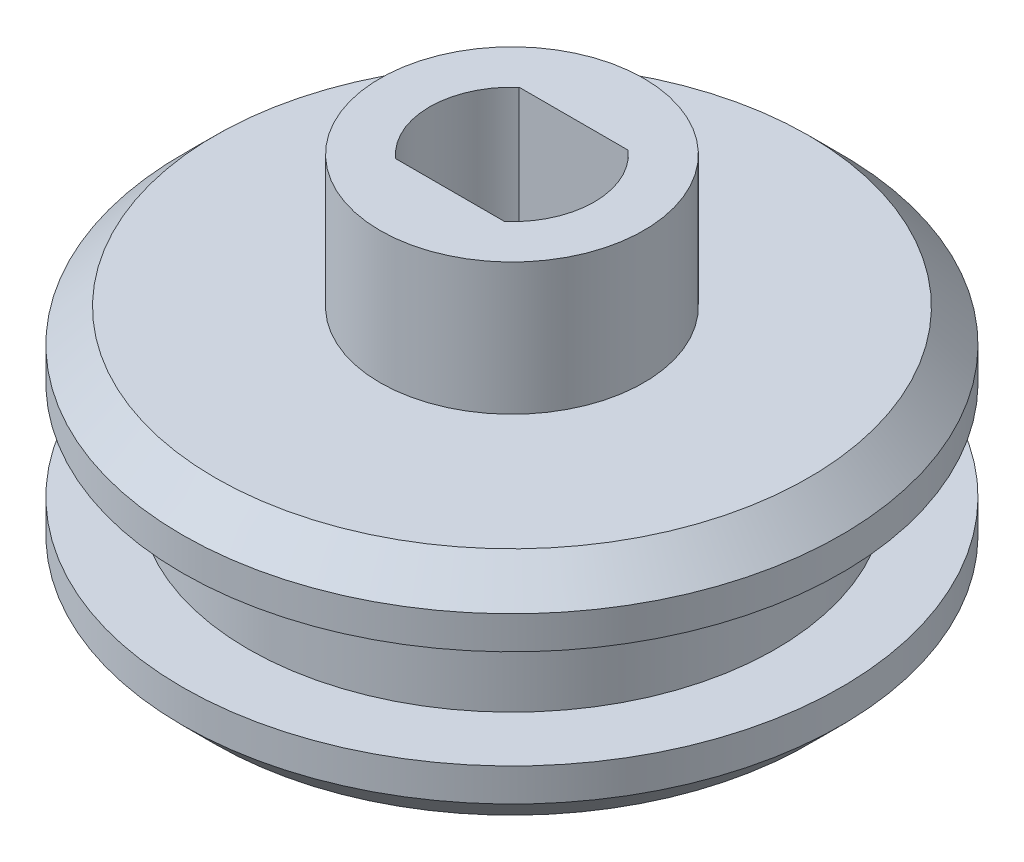
ISO-10303-21;
HEADER;
FILE_DESCRIPTION(('STEP AP214'),'2;1');
FILE_NAME('part.step','',(''),(''),'','','');
FILE_SCHEMA(('AUTOMOTIVE_DESIGN { 1 0 10303 214 1 1 1 1 }'));
ENDSEC;
DATA;
#1=APPLICATION_CONTEXT('core data for automotive mechanical design processes');
#2=APPLICATION_PROTOCOL_DEFINITION('international standard','automotive_design',2000,#1);
#3=PRODUCT_CONTEXT('',#1,'mechanical');
#4=PRODUCT('Part','Part','',(#3));
#5=PRODUCT_RELATED_PRODUCT_CATEGORY('part','',(#4));
#6=PRODUCT_DEFINITION_FORMATION('','',#4);
#7=PRODUCT_DEFINITION_CONTEXT('part definition',#1,'design');
#8=PRODUCT_DEFINITION('design','',#6,#7);
#9=PRODUCT_DEFINITION_SHAPE('','',#8);
#10=(LENGTH_UNIT() NAMED_UNIT(*) SI_UNIT(.MILLI.,.METRE.));
#11=(NAMED_UNIT(*) PLANE_ANGLE_UNIT() SI_UNIT($,.RADIAN.));
#12=(NAMED_UNIT(*) SI_UNIT($,.STERADIAN.) SOLID_ANGLE_UNIT());
#13=UNCERTAINTY_MEASURE_WITH_UNIT(LENGTH_MEASURE(1.E-05),#10,'distance_accuracy_value','');
#14=(GEOMETRIC_REPRESENTATION_CONTEXT(3) GLOBAL_UNCERTAINTY_ASSIGNED_CONTEXT((#13)) GLOBAL_UNIT_ASSIGNED_CONTEXT((#10,
#11,#12)) REPRESENTATION_CONTEXT('',''));
#15=CARTESIAN_POINT('',(0.,0.,0.));
#16=DIRECTION('',(0.,0.,1.));
#17=DIRECTION('',(1.,0.,0.));
#18=AXIS2_PLACEMENT_3D('',#15,#16,#17);
#19=CARTESIAN_POINT('',(0.,11.,0.));
#20=DIRECTION('',(0.,-1.,0.));
#21=DIRECTION('',(0.,0.,-1.));
#22=AXIS2_PLACEMENT_3D('',#19,#20,#21);
#23=CYLINDRICAL_SURFACE('',#22,1.);
#24=CARTESIAN_POINT('',(0.,7.,0.));
#25=DIRECTION('',(0.,1.,0.));
#26=DIRECTION('',(0.,0.,1.));
#27=AXIS2_PLACEMENT_3D('',#24,#25,#26);
#28=CIRCLE('',#27,1.);
#29=CARTESIAN_POINT('',(0.,7.,1.));
#30=VERTEX_POINT('',#29);
#31=EDGE_CURVE('E128',#30,#30,#28,.T.);
#32=ORIENTED_EDGE('',*,*,#31,.T.);
#33=EDGE_LOOP('',(#32));
#34=FACE_BOUND('',#33,.T.);
#35=CARTESIAN_POINT('',(0.,5.,0.));
#36=DIRECTION('',(0.,-1.,0.));
#37=DIRECTION('',(0.,0.,-1.));
#38=AXIS2_PLACEMENT_3D('',#35,#36,#37);
#39=CIRCLE('',#38,1.);
#40=CARTESIAN_POINT('',(0.,5.,-1.));
#41=VERTEX_POINT('',#40);
#42=EDGE_CURVE('E50',#41,#41,#39,.F.);
#43=ORIENTED_EDGE('',*,*,#42,.F.);
#44=EDGE_LOOP('',(#43));
#45=FACE_BOUND('',#44,.T.);
#46=ADVANCED_FACE('F45',(#34,#45),#23,.F.);
#47=CARTESIAN_POINT('',(0.,11.,0.));
#48=DIRECTION('',(0.,1.,0.));
#49=DIRECTION('',(0.,0.,1.));
#50=AXIS2_PLACEMENT_3D('',#47,#48,#49);
#51=PLANE('',#50);
#52=CARTESIAN_POINT('',(0.,11.,0.));
#53=DIRECTION('',(0.,1.,0.));
#54=DIRECTION('',(0.,0.,1.));
#55=AXIS2_PLACEMENT_3D('',#52,#53,#54);
#56=CIRCLE('',#55,4.);
#57=CARTESIAN_POINT('',(0.,11.,4.));
#58=VERTEX_POINT('',#57);
#59=EDGE_CURVE('E111',#58,#58,#56,.T.);
#60=ORIENTED_EDGE('',*,*,#59,.T.);
#61=EDGE_LOOP('',(#60));
#62=FACE_BOUND('',#61,.T.);
#63=DIRECTION('',(-1.,0.,0.));
#64=VECTOR('',#63,1.);
#65=CARTESIAN_POINT('',(-1.65359456941537,11.,-1.875));
#66=LINE('',#65,#64);
#67=CARTESIAN_POINT('',(1.65359456941537,11.,-1.875));
#68=VERTEX_POINT('',#67);
#69=CARTESIAN_POINT('',(-1.65359456941537,11.,-1.875));
#70=VERTEX_POINT('',#69);
#71=EDGE_CURVE('E103',#68,#70,#66,.T.);
#72=ORIENTED_EDGE('',*,*,#71,.F.);
#73=CARTESIAN_POINT('',(0.,11.,0.));
#74=DIRECTION('',(0.,1.,0.));
#75=DIRECTION('',(0.,0.,1.));
#76=AXIS2_PLACEMENT_3D('',#73,#74,#75);
#77=CIRCLE('',#76,2.5);
#78=CARTESIAN_POINT('',(1.65359456941537,11.,1.875));
#79=VERTEX_POINT('',#78);
#80=EDGE_CURVE('E94',#79,#68,#77,.T.);
#81=ORIENTED_EDGE('',*,*,#80,.F.);
#82=DIRECTION('',(1.,0.,0.));
#83=VECTOR('',#82,1.);
#84=CARTESIAN_POINT('',(-1.65359456941537,11.,1.875));
#85=LINE('',#84,#83);
#86=CARTESIAN_POINT('',(-1.65359456941537,11.,1.875));
#87=VERTEX_POINT('',#86);
#88=EDGE_CURVE('E70',#87,#79,#85,.T.);
#89=ORIENTED_EDGE('',*,*,#88,.F.);
#90=CARTESIAN_POINT('',(0.,11.,0.));
#91=DIRECTION('',(0.,1.,0.));
#92=DIRECTION('',(0.,0.,1.));
#93=AXIS2_PLACEMENT_3D('',#90,#91,#92);
#94=CIRCLE('',#93,2.5);
#95=EDGE_CURVE('E116',#70,#87,#94,.T.);
#96=ORIENTED_EDGE('',*,*,#95,.F.);
#97=EDGE_LOOP('',(#72,#81,#89,#96));
#98=FACE_BOUND('',#97,.T.);
#99=ADVANCED_FACE('F115',(#62,#98),#51,.T.);
#100=CARTESIAN_POINT('',(0.,2.,0.));
#101=DIRECTION('',(0.,-1.,0.));
#102=DIRECTION('',(0.,0.,-1.));
#103=AXIS2_PLACEMENT_3D('',#100,#101,#102);
#104=CYLINDRICAL_SURFACE('',#103,10.);
#105=CARTESIAN_POINT('',(0.,0.999999999999997,0.));
#106=DIRECTION('',(0.,1.,0.));
#107=DIRECTION('',(0.,0.,1.));
#108=AXIS2_PLACEMENT_3D('',#105,#106,#107);
#109=CIRCLE('',#108,10.);
#110=CARTESIAN_POINT('',(0.,0.999999999999997,10.));
#111=VERTEX_POINT('',#110);
#112=EDGE_CURVE('E169',#111,#111,#109,.T.);
#113=ORIENTED_EDGE('',*,*,#112,.T.);
#114=EDGE_LOOP('',(#113));
#115=FACE_BOUND('',#114,.T.);
#116=CARTESIAN_POINT('',(0.,2.,0.));
#117=DIRECTION('',(0.,1.,0.));
#118=DIRECTION('',(0.,0.,1.));
#119=AXIS2_PLACEMENT_3D('',#116,#117,#118);
#120=CIRCLE('',#119,10.);
#121=CARTESIAN_POINT('',(0.,2.,10.));
#122=VERTEX_POINT('',#121);
#123=EDGE_CURVE('E153',#122,#122,#120,.T.);
#124=ORIENTED_EDGE('',*,*,#123,.F.);
#125=EDGE_LOOP('',(#124));
#126=FACE_BOUND('',#125,.T.);
#127=ADVANCED_FACE('F210',(#115,#126),#104,.T.);
#128=CARTESIAN_POINT('',(0.,2.,0.));
#129=DIRECTION('',(0.,1.,0.));
#130=DIRECTION('',(0.,0.,1.));
#131=AXIS2_PLACEMENT_3D('',#128,#129,#130);
#132=PLANE('',#131);
#133=CARTESIAN_POINT('',(0.,2.,0.));
#134=DIRECTION('',(0.,1.,0.));
#135=DIRECTION('',(0.,0.,1.));
#136=AXIS2_PLACEMENT_3D('',#133,#134,#135);
#137=CIRCLE('',#136,8.);
#138=CARTESIAN_POINT('',(0.,2.,8.));
#139=VERTEX_POINT('',#138);
#140=EDGE_CURVE('E154',#139,#139,#137,.T.);
#141=ORIENTED_EDGE('',*,*,#140,.F.);
#142=EDGE_LOOP('',(#141));
#143=FACE_BOUND('',#142,.T.);
#144=ORIENTED_EDGE('',*,*,#123,.T.);
#145=EDGE_LOOP('',(#144));
#146=FACE_BOUND('',#145,.T.);
#147=ADVANCED_FACE('F200',(#143,#146),#132,.T.);
#148=CARTESIAN_POINT('',(0.,0.,0.));
#149=DIRECTION('',(0.,1.,0.));
#150=DIRECTION('',(0.,0.,1.));
#151=AXIS2_PLACEMENT_3D('',#148,#149,#150);
#152=PLANE('',#151);
#153=CARTESIAN_POINT('',(0.,0.,0.));
#154=DIRECTION('',(0.,-1.,0.));
#155=DIRECTION('',(0.,0.,-1.));
#156=AXIS2_PLACEMENT_3D('',#153,#154,#155);
#157=CIRCLE('',#156,2.5);
#158=CARTESIAN_POINT('',(0.,0.,-2.5));
#159=VERTEX_POINT('',#158);
#160=EDGE_CURVE('E186',#159,#159,#157,.T.);
#161=ORIENTED_EDGE('',*,*,#160,.F.);
#162=EDGE_LOOP('',(#161));
#163=FACE_BOUND('',#162,.T.);
#164=CARTESIAN_POINT('',(0.,0.,0.));
#165=DIRECTION('',(0.,1.,0.));
#166=DIRECTION('',(0.,0.,1.));
#167=AXIS2_PLACEMENT_3D('',#164,#165,#166);
#168=CIRCLE('',#167,9.);
#169=CARTESIAN_POINT('',(0.,0.,9.));
#170=VERTEX_POINT('',#169);
#171=EDGE_CURVE('E56',#170,#170,#168,.F.);
#172=ORIENTED_EDGE('',*,*,#171,.T.);
#173=EDGE_LOOP('',(#172));
#174=FACE_BOUND('',#173,.T.);
#175=ADVANCED_FACE('F196',(#163,#174),#152,.F.);
#176=CARTESIAN_POINT('',(0.,5.,0.));
#177=DIRECTION('',(0.,-1.,0.));
#178=DIRECTION('',(0.,0.,-1.));
#179=AXIS2_PLACEMENT_3D('',#176,#177,#178);
#180=CYLINDRICAL_SURFACE('',#179,8.);
#181=CARTESIAN_POINT('',(0.,5.,0.));
#182=DIRECTION('',(0.,1.,0.));
#183=DIRECTION('',(0.,0.,1.));
#184=AXIS2_PLACEMENT_3D('',#181,#182,#183);
#185=CIRCLE('',#184,8.);
#186=CARTESIAN_POINT('',(0.,5.,8.));
#187=VERTEX_POINT('',#186);
#188=EDGE_CURVE('E149',#187,#187,#185,.T.);
#189=ORIENTED_EDGE('',*,*,#188,.F.);
#190=EDGE_LOOP('',(#189));
#191=FACE_BOUND('',#190,.T.);
#192=ORIENTED_EDGE('',*,*,#140,.T.);
#193=EDGE_LOOP('',(#192));
#194=FACE_BOUND('',#193,.T.);
#195=ADVANCED_FACE('F199',(#191,#194),#180,.T.);
#196=CARTESIAN_POINT('',(0.,7.,0.));
#197=DIRECTION('',(0.,-1.,0.));
#198=DIRECTION('',(0.,0.,-1.));
#199=AXIS2_PLACEMENT_3D('',#196,#197,#198);
#200=CYLINDRICAL_SURFACE('',#199,10.);
#201=CARTESIAN_POINT('',(0.,6.,0.));
#202=DIRECTION('',(0.,1.,0.));
#203=DIRECTION('',(0.,0.,1.));
#204=AXIS2_PLACEMENT_3D('',#201,#202,#203);
#205=CIRCLE('',#204,10.);
#206=CARTESIAN_POINT('',(0.,6.,10.));
#207=VERTEX_POINT('',#206);
#208=EDGE_CURVE('E165',#207,#207,#205,.F.);
#209=ORIENTED_EDGE('',*,*,#208,.T.);
#210=EDGE_LOOP('',(#209));
#211=FACE_BOUND('',#210,.T.);
#212=CARTESIAN_POINT('',(0.,5.,0.));
#213=DIRECTION('',(0.,1.,0.));
#214=DIRECTION('',(0.,0.,1.));
#215=AXIS2_PLACEMENT_3D('',#212,#213,#214);
#216=CIRCLE('',#215,10.);
#217=CARTESIAN_POINT('',(0.,5.,10.));
#218=VERTEX_POINT('',#217);
#219=EDGE_CURVE('E144',#218,#218,#216,.T.);
#220=ORIENTED_EDGE('',*,*,#219,.T.);
#221=EDGE_LOOP('',(#220));
#222=FACE_BOUND('',#221,.T.);
#223=ADVANCED_FACE('F257',(#211,#222),#200,.T.);
#224=CARTESIAN_POINT('',(0.,7.,0.));
#225=DIRECTION('',(0.,1.,0.));
#226=DIRECTION('',(0.,0.,1.));
#227=AXIS2_PLACEMENT_3D('',#224,#225,#226);
#228=PLANE('',#227);
#229=CARTESIAN_POINT('',(0.,7.,0.));
#230=DIRECTION('',(0.,1.,0.));
#231=DIRECTION('',(0.,0.,1.));
#232=AXIS2_PLACEMENT_3D('',#229,#230,#231);
#233=CIRCLE('',#232,4.);
#234=CARTESIAN_POINT('',(0.,7.,4.));
#235=VERTEX_POINT('',#234);
#236=EDGE_CURVE('E11',#235,#235,#233,.T.);
#237=ORIENTED_EDGE('',*,*,#236,.F.);
#238=EDGE_LOOP('',(#237));
#239=FACE_BOUND('',#238,.T.);
#240=CARTESIAN_POINT('',(0.,7.,0.));
#241=DIRECTION('',(0.,1.,0.));
#242=DIRECTION('',(0.,0.,1.));
#243=AXIS2_PLACEMENT_3D('',#240,#241,#242);
#244=CIRCLE('',#243,9.00000000000001);
#245=CARTESIAN_POINT('',(0.,7.,9.00000000000001));
#246=VERTEX_POINT('',#245);
#247=EDGE_CURVE('E158',#246,#246,#244,.T.);
#248=ORIENTED_EDGE('',*,*,#247,.T.);
#249=EDGE_LOOP('',(#248));
#250=FACE_BOUND('',#249,.T.);
#251=ADVANCED_FACE('F253',(#239,#250),#228,.T.);
#252=CARTESIAN_POINT('',(0.,5.,0.));
#253=DIRECTION('',(0.,1.,0.));
#254=DIRECTION('',(0.,0.,1.));
#255=AXIS2_PLACEMENT_3D('',#252,#253,#254);
#256=PLANE('',#255);
#257=ORIENTED_EDGE('',*,*,#188,.T.);
#258=EDGE_LOOP('',(#257));
#259=FACE_BOUND('',#258,.T.);
#260=ORIENTED_EDGE('',*,*,#219,.F.);
#261=EDGE_LOOP('',(#260));
#262=FACE_BOUND('',#261,.T.);
#263=ADVANCED_FACE('F256',(#259,#262),#256,.F.);
#264=CARTESIAN_POINT('',(0.,7.,0.));
#265=DIRECTION('',(0.,-1.,0.));
#266=DIRECTION('',(0.,0.,-1.));
#267=AXIS2_PLACEMENT_3D('',#264,#265,#266);
#268=CONICAL_SURFACE('',#267,9.00000000000001,0.785398163397446);
#269=ORIENTED_EDGE('',*,*,#208,.F.);
#270=EDGE_LOOP('',(#269));
#271=FACE_BOUND('',#270,.T.);
#272=ORIENTED_EDGE('',*,*,#247,.F.);
#273=EDGE_LOOP('',(#272));
#274=FACE_BOUND('',#273,.T.);
#275=ADVANCED_FACE('F207',(#271,#274),#268,.T.);
#276=CARTESIAN_POINT('',(0.,0.999999999999997,0.));
#277=DIRECTION('',(0.,1.,0.));
#278=DIRECTION('',(0.,0.,1.));
#279=AXIS2_PLACEMENT_3D('',#276,#277,#278);
#280=CONICAL_SURFACE('',#279,10.,0.785398163397449);
#281=ORIENTED_EDGE('',*,*,#171,.F.);
#282=EDGE_LOOP('',(#281));
#283=FACE_BOUND('',#282,.T.);
#284=ORIENTED_EDGE('',*,*,#112,.F.);
#285=EDGE_LOOP('',(#284));
#286=FACE_BOUND('',#285,.T.);
#287=ADVANCED_FACE('F48',(#283,#286),#280,.T.);
#288=CARTESIAN_POINT('',(0.,11.,0.));
#289=DIRECTION('',(0.,-1.,0.));
#290=DIRECTION('',(0.,0.,-1.));
#291=AXIS2_PLACEMENT_3D('',#288,#289,#290);
#292=CYLINDRICAL_SURFACE('',#291,4.);
#293=ORIENTED_EDGE('',*,*,#59,.F.);
#294=EDGE_LOOP('',(#293));
#295=FACE_BOUND('',#294,.T.);
#296=ORIENTED_EDGE('',*,*,#236,.T.);
#297=EDGE_LOOP('',(#296));
#298=FACE_BOUND('',#297,.T.);
#299=ADVANCED_FACE('F206',(#295,#298),#292,.T.);
#300=CARTESIAN_POINT('',(0.,11.,0.));
#301=DIRECTION('',(0.,-1.,0.));
#302=DIRECTION('',(0.,0.,-1.));
#303=AXIS2_PLACEMENT_3D('',#300,#301,#302);
#304=CYLINDRICAL_SURFACE('',#303,2.5);
#305=CARTESIAN_POINT('',(0.,7.,0.));
#306=DIRECTION('',(0.,1.,0.));
#307=DIRECTION('',(0.,0.,1.));
#308=AXIS2_PLACEMENT_3D('',#305,#306,#307);
#309=CIRCLE('',#308,2.5);
#310=CARTESIAN_POINT('',(1.65359456941537,7.,1.875));
#311=VERTEX_POINT('',#310);
#312=CARTESIAN_POINT('',(1.65359456941537,7.,-1.875));
#313=VERTEX_POINT('',#312);
#314=EDGE_CURVE('E125',#311,#313,#309,.T.);
#315=ORIENTED_EDGE('',*,*,#314,.F.);
#316=DIRECTION('',(0.,-1.,0.));
#317=VECTOR('',#316,1.);
#318=CARTESIAN_POINT('',(1.65359456941537,11.,1.875));
#319=LINE('',#318,#317);
#320=EDGE_CURVE('E99',#79,#311,#319,.T.);
#321=ORIENTED_EDGE('',*,*,#320,.F.);
#322=ORIENTED_EDGE('',*,*,#80,.T.);
#323=DIRECTION('',(0.,-1.,0.));
#324=VECTOR('',#323,1.);
#325=CARTESIAN_POINT('',(1.65359456941537,11.,-1.875));
#326=LINE('',#325,#324);
#327=EDGE_CURVE('E98',#68,#313,#326,.T.);
#328=ORIENTED_EDGE('',*,*,#327,.T.);
#329=EDGE_LOOP('',(#315,#321,#322,#328));
#330=FACE_BOUND('',#329,.T.);
#331=ADVANCED_FACE('F97',(#330),#304,.F.);
#332=CARTESIAN_POINT('',(-1.65359456941537,11.,-1.875));
#333=DIRECTION('',(0.,0.,1.));
#334=DIRECTION('',(1.,0.,0.));
#335=AXIS2_PLACEMENT_3D('',#332,#333,#334);
#336=PLANE('',#335);
#337=DIRECTION('',(-1.,0.,0.));
#338=VECTOR('',#337,1.);
#339=CARTESIAN_POINT('',(-1.65359456941537,7.,-1.875));
#340=LINE('',#339,#338);
#341=CARTESIAN_POINT('',(-1.65359456941537,7.,-1.875));
#342=VERTEX_POINT('',#341);
#343=EDGE_CURVE('E109',#313,#342,#340,.T.);
#344=ORIENTED_EDGE('',*,*,#343,.F.);
#345=ORIENTED_EDGE('',*,*,#327,.F.);
#346=ORIENTED_EDGE('',*,*,#71,.T.);
#347=DIRECTION('',(0.,-1.,0.));
#348=VECTOR('',#347,1.);
#349=CARTESIAN_POINT('',(-1.65359456941537,11.,-1.875));
#350=LINE('',#349,#348);
#351=EDGE_CURVE('E112',#70,#342,#350,.T.);
#352=ORIENTED_EDGE('',*,*,#351,.T.);
#353=EDGE_LOOP('',(#344,#345,#346,#352));
#354=FACE_BOUND('',#353,.T.);
#355=ADVANCED_FACE('F106',(#354),#336,.T.);
#356=CARTESIAN_POINT('',(0.,11.,0.));
#357=DIRECTION('',(0.,-1.,0.));
#358=DIRECTION('',(0.,0.,-1.));
#359=AXIS2_PLACEMENT_3D('',#356,#357,#358);
#360=CYLINDRICAL_SURFACE('',#359,2.5);
#361=CARTESIAN_POINT('',(0.,7.,0.));
#362=DIRECTION('',(0.,1.,0.));
#363=DIRECTION('',(0.,0.,1.));
#364=AXIS2_PLACEMENT_3D('',#361,#362,#363);
#365=CIRCLE('',#364,2.5);
#366=CARTESIAN_POINT('',(-1.65359456941537,7.,1.875));
#367=VERTEX_POINT('',#366);
#368=EDGE_CURVE('E131',#342,#367,#365,.T.);
#369=ORIENTED_EDGE('',*,*,#368,.F.);
#370=ORIENTED_EDGE('',*,*,#351,.F.);
#371=ORIENTED_EDGE('',*,*,#95,.T.);
#372=DIRECTION('',(0.,-1.,0.));
#373=VECTOR('',#372,1.);
#374=CARTESIAN_POINT('',(-1.65359456941537,11.,1.875));
#375=LINE('',#374,#373);
#376=EDGE_CURVE('E64',#87,#367,#375,.T.);
#377=ORIENTED_EDGE('',*,*,#376,.T.);
#378=EDGE_LOOP('',(#369,#370,#371,#377));
#379=FACE_BOUND('',#378,.T.);
#380=ADVANCED_FACE('F242',(#379),#360,.F.);
#381=CARTESIAN_POINT('',(-1.65359456941537,11.,1.875));
#382=DIRECTION('',(0.,0.,-1.));
#383=DIRECTION('',(-1.,0.,0.));
#384=AXIS2_PLACEMENT_3D('',#381,#382,#383);
#385=PLANE('',#384);
#386=DIRECTION('',(1.,0.,0.));
#387=VECTOR('',#386,1.);
#388=CARTESIAN_POINT('',(-1.65359456941537,7.,1.875));
#389=LINE('',#388,#387);
#390=EDGE_CURVE('E89',#367,#311,#389,.T.);
#391=ORIENTED_EDGE('',*,*,#390,.F.);
#392=ORIENTED_EDGE('',*,*,#376,.F.);
#393=ORIENTED_EDGE('',*,*,#88,.T.);
#394=ORIENTED_EDGE('',*,*,#320,.T.);
#395=EDGE_LOOP('',(#391,#392,#393,#394));
#396=FACE_BOUND('',#395,.T.);
#397=ADVANCED_FACE('F238',(#396),#385,.T.);
#398=CARTESIAN_POINT('',(0.,7.,0.));
#399=DIRECTION('',(0.,1.,0.));
#400=DIRECTION('',(0.,0.,1.));
#401=AXIS2_PLACEMENT_3D('',#398,#399,#400);
#402=PLANE('',#401);
#403=ORIENTED_EDGE('',*,*,#31,.F.);
#404=EDGE_LOOP('',(#403));
#405=FACE_BOUND('',#404,.T.);
#406=ORIENTED_EDGE('',*,*,#314,.T.);
#407=ORIENTED_EDGE('',*,*,#343,.T.);
#408=ORIENTED_EDGE('',*,*,#368,.T.);
#409=ORIENTED_EDGE('',*,*,#390,.T.);
#410=EDGE_LOOP('',(#406,#407,#408,#409));
#411=FACE_BOUND('',#410,.T.);
#412=ADVANCED_FACE('F234',(#405,#411),#402,.T.);
#413=CARTESIAN_POINT('',(0.,5.,0.));
#414=DIRECTION('',(0.,-1.,0.));
#415=DIRECTION('',(0.,0.,-1.));
#416=AXIS2_PLACEMENT_3D('',#413,#414,#415);
#417=PLANE('',#416);
#418=CARTESIAN_POINT('',(0.,5.,0.));
#419=DIRECTION('',(0.,-1.,0.));
#420=DIRECTION('',(0.,0.,-1.));
#421=AXIS2_PLACEMENT_3D('',#418,#419,#420);
#422=CIRCLE('',#421,2.5);
#423=CARTESIAN_POINT('',(0.,5.,-2.5));
#424=VERTEX_POINT('',#423);
#425=EDGE_CURVE('E181',#424,#424,#422,.T.);
#426=ORIENTED_EDGE('',*,*,#425,.T.);
#427=EDGE_LOOP('',(#426));
#428=FACE_BOUND('',#427,.T.);
#429=ORIENTED_EDGE('',*,*,#42,.T.);
#430=EDGE_LOOP('',(#429));
#431=FACE_BOUND('',#430,.T.);
#432=ADVANCED_FACE('F237',(#428,#431),#417,.T.);
#433=CARTESIAN_POINT('',(0.,5.,0.));
#434=DIRECTION('',(0.,-1.,0.));
#435=DIRECTION('',(0.,0.,-1.));
#436=AXIS2_PLACEMENT_3D('',#433,#434,#435);
#437=CYLINDRICAL_SURFACE('',#436,2.5);
#438=ORIENTED_EDGE('',*,*,#425,.F.);
#439=EDGE_LOOP('',(#438));
#440=FACE_BOUND('',#439,.T.);
#441=ORIENTED_EDGE('',*,*,#160,.T.);
#442=EDGE_LOOP('',(#441));
#443=FACE_BOUND('',#442,.T.);
#444=ADVANCED_FACE('F194',(#440,#443),#437,.F.);
#445=CLOSED_SHELL('',(#46,#99,#127,#147,#175,#195,#223,#251,#263,#275,#287,#299,#331,#355,#380,
#397,#412,#432,#444));
#446=MANIFOLD_SOLID_BREP('B2',#445);
#447=ADVANCED_BREP_SHAPE_REPRESENTATION('',(#18,#446),#14);
#448=SHAPE_DEFINITION_REPRESENTATION(#9,#447);
ENDSEC;
END-ISO-10303-21;
